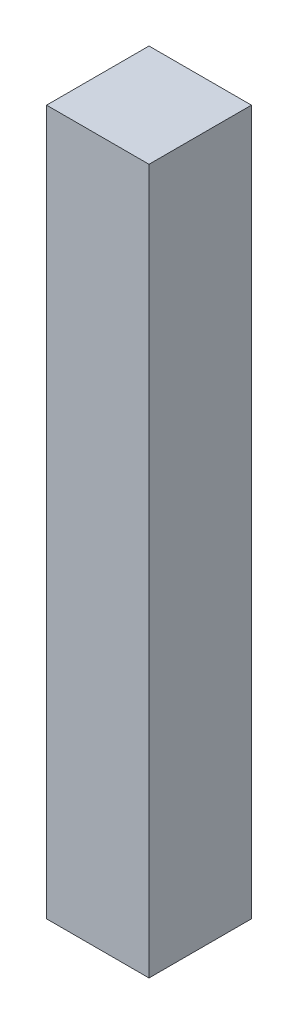
ISO-10303-21;
HEADER;
FILE_DESCRIPTION(('STEP AP214'),'2;1');
FILE_NAME('part.step','',(''),(''),'','','');
FILE_SCHEMA(('AUTOMOTIVE_DESIGN { 1 0 10303 214 1 1 1 1 }'));
ENDSEC;
DATA;
#1=APPLICATION_CONTEXT('core data for automotive mechanical design processes');
#2=APPLICATION_PROTOCOL_DEFINITION('international standard','automotive_design',2000,#1);
#3=PRODUCT_CONTEXT('',#1,'mechanical');
#4=PRODUCT('Part','Part','',(#3));
#5=PRODUCT_RELATED_PRODUCT_CATEGORY('part','',(#4));
#6=PRODUCT_DEFINITION_FORMATION('','',#4);
#7=PRODUCT_DEFINITION_CONTEXT('part definition',#1,'design');
#8=PRODUCT_DEFINITION('design','',#6,#7);
#9=PRODUCT_DEFINITION_SHAPE('','',#8);
#10=(LENGTH_UNIT() NAMED_UNIT(*) SI_UNIT(.MILLI.,.METRE.));
#11=(NAMED_UNIT(*) PLANE_ANGLE_UNIT() SI_UNIT($,.RADIAN.));
#12=(NAMED_UNIT(*) SI_UNIT($,.STERADIAN.) SOLID_ANGLE_UNIT());
#13=UNCERTAINTY_MEASURE_WITH_UNIT(LENGTH_MEASURE(1.E-05),#10,'distance_accuracy_value','');
#14=(GEOMETRIC_REPRESENTATION_CONTEXT(3) GLOBAL_UNCERTAINTY_ASSIGNED_CONTEXT((#13)) GLOBAL_UNIT_ASSIGNED_CONTEXT((#10,
#11,#12)) REPRESENTATION_CONTEXT('',''));
#15=CARTESIAN_POINT('',(0.,0.,0.));
#16=DIRECTION('',(0.,0.,1.));
#17=DIRECTION('',(1.,0.,0.));
#18=AXIS2_PLACEMENT_3D('',#15,#16,#17);
#19=CARTESIAN_POINT('',(7.493,103.1113,7.493));
#20=DIRECTION('',(-1.,0.,0.));
#21=DIRECTION('',(0.,0.,1.));
#22=AXIS2_PLACEMENT_3D('',#19,#20,#21);
#23=PLANE('',#22);
#24=DIRECTION('',(0.,0.,-1.));
#25=VECTOR('',#24,1.);
#26=CARTESIAN_POINT('',(7.493,0.,7.493));
#27=LINE('',#26,#25);
#28=CARTESIAN_POINT('',(7.493,0.,7.493));
#29=VERTEX_POINT('',#28);
#30=CARTESIAN_POINT('',(7.493,0.,-7.493));
#31=VERTEX_POINT('',#30);
#32=EDGE_CURVE('E96',#29,#31,#27,.T.);
#33=ORIENTED_EDGE('',*,*,#32,.T.);
#34=DIRECTION('',(0.,-1.,0.));
#35=VECTOR('',#34,1.);
#36=CARTESIAN_POINT('',(7.493,103.1113,-7.493));
#37=LINE('',#36,#35);
#38=CARTESIAN_POINT('',(7.493,103.1113,-7.493));
#39=VERTEX_POINT('',#38);
#40=EDGE_CURVE('E11',#39,#31,#37,.T.);
#41=ORIENTED_EDGE('',*,*,#40,.F.);
#42=DIRECTION('',(0.,0.,-1.));
#43=VECTOR('',#42,1.);
#44=CARTESIAN_POINT('',(7.493,103.1113,7.493));
#45=LINE('',#44,#43);
#46=CARTESIAN_POINT('',(7.493,103.1113,7.493));
#47=VERTEX_POINT('',#46);
#48=EDGE_CURVE('E84',#47,#39,#45,.T.);
#49=ORIENTED_EDGE('',*,*,#48,.F.);
#50=DIRECTION('',(0.,-1.,0.));
#51=VECTOR('',#50,1.);
#52=CARTESIAN_POINT('',(7.493,103.1113,7.493));
#53=LINE('',#52,#51);
#54=EDGE_CURVE('E92',#47,#29,#53,.T.);
#55=ORIENTED_EDGE('',*,*,#54,.T.);
#56=EDGE_LOOP('',(#33,#41,#49,#55));
#57=FACE_BOUND('',#56,.T.);
#58=ADVANCED_FACE('F33',(#57),#23,.F.);
#59=CARTESIAN_POINT('',(-7.493,103.1113,-7.493));
#60=DIRECTION('',(0.,0.,1.));
#61=DIRECTION('',(1.,0.,0.));
#62=AXIS2_PLACEMENT_3D('',#59,#60,#61);
#63=PLANE('',#62);
#64=DIRECTION('',(-1.,0.,0.));
#65=VECTOR('',#64,1.);
#66=CARTESIAN_POINT('',(-7.493,0.,-7.493));
#67=LINE('',#66,#65);
#68=CARTESIAN_POINT('',(-7.493,0.,-7.493));
#69=VERTEX_POINT('',#68);
#70=EDGE_CURVE('E88',#31,#69,#67,.T.);
#71=ORIENTED_EDGE('',*,*,#70,.T.);
#72=DIRECTION('',(0.,-1.,0.));
#73=VECTOR('',#72,1.);
#74=CARTESIAN_POINT('',(-7.493,103.1113,-7.493));
#75=LINE('',#74,#73);
#76=CARTESIAN_POINT('',(-7.493,103.1113,-7.493));
#77=VERTEX_POINT('',#76);
#78=EDGE_CURVE('E41',#77,#69,#75,.T.);
#79=ORIENTED_EDGE('',*,*,#78,.F.);
#80=DIRECTION('',(-1.,0.,0.));
#81=VECTOR('',#80,1.);
#82=CARTESIAN_POINT('',(-7.493,103.1113,-7.493));
#83=LINE('',#82,#81);
#84=EDGE_CURVE('E79',#39,#77,#83,.T.);
#85=ORIENTED_EDGE('',*,*,#84,.F.);
#86=ORIENTED_EDGE('',*,*,#40,.T.);
#87=EDGE_LOOP('',(#71,#79,#85,#86));
#88=FACE_BOUND('',#87,.T.);
#89=ADVANCED_FACE('F87',(#88),#63,.F.);
#90=CARTESIAN_POINT('',(-7.493,103.1113,7.493));
#91=DIRECTION('',(1.,0.,0.));
#92=DIRECTION('',(0.,0.,-1.));
#93=AXIS2_PLACEMENT_3D('',#90,#91,#92);
#94=PLANE('',#93);
#95=DIRECTION('',(0.,0.,1.));
#96=VECTOR('',#95,1.);
#97=CARTESIAN_POINT('',(-7.493,0.,7.493));
#98=LINE('',#97,#96);
#99=CARTESIAN_POINT('',(-7.493,0.,7.493));
#100=VERTEX_POINT('',#99);
#101=EDGE_CURVE('E66',#69,#100,#98,.T.);
#102=ORIENTED_EDGE('',*,*,#101,.T.);
#103=DIRECTION('',(0.,-1.,0.));
#104=VECTOR('',#103,1.);
#105=CARTESIAN_POINT('',(-7.493,103.1113,7.493));
#106=LINE('',#105,#104);
#107=CARTESIAN_POINT('',(-7.493,103.1113,7.493));
#108=VERTEX_POINT('',#107);
#109=EDGE_CURVE('E89',#108,#100,#106,.T.);
#110=ORIENTED_EDGE('',*,*,#109,.F.);
#111=DIRECTION('',(0.,0.,1.));
#112=VECTOR('',#111,1.);
#113=CARTESIAN_POINT('',(-7.493,103.1113,7.493));
#114=LINE('',#113,#112);
#115=EDGE_CURVE('E82',#77,#108,#114,.T.);
#116=ORIENTED_EDGE('',*,*,#115,.F.);
#117=ORIENTED_EDGE('',*,*,#78,.T.);
#118=EDGE_LOOP('',(#102,#110,#116,#117));
#119=FACE_BOUND('',#118,.T.);
#120=ADVANCED_FACE('F90',(#119),#94,.F.);
#121=CARTESIAN_POINT('',(-7.493,103.1113,7.493));
#122=DIRECTION('',(0.,0.,-1.));
#123=DIRECTION('',(-1.,0.,0.));
#124=AXIS2_PLACEMENT_3D('',#121,#122,#123);
#125=PLANE('',#124);
#126=DIRECTION('',(1.,0.,0.));
#127=VECTOR('',#126,1.);
#128=CARTESIAN_POINT('',(-7.493,0.,7.493));
#129=LINE('',#128,#127);
#130=EDGE_CURVE('E72',#100,#29,#129,.T.);
#131=ORIENTED_EDGE('',*,*,#130,.T.);
#132=ORIENTED_EDGE('',*,*,#54,.F.);
#133=DIRECTION('',(1.,0.,0.));
#134=VECTOR('',#133,1.);
#135=CARTESIAN_POINT('',(-7.493,103.1113,7.493));
#136=LINE('',#135,#134);
#137=EDGE_CURVE('E49',#108,#47,#136,.T.);
#138=ORIENTED_EDGE('',*,*,#137,.F.);
#139=ORIENTED_EDGE('',*,*,#109,.T.);
#140=EDGE_LOOP('',(#131,#132,#138,#139));
#141=FACE_BOUND('',#140,.T.);
#142=ADVANCED_FACE('F103',(#141),#125,.F.);
#143=CARTESIAN_POINT('',(0.,103.1113,0.));
#144=DIRECTION('',(0.,-1.,0.));
#145=DIRECTION('',(0.,0.,-1.));
#146=AXIS2_PLACEMENT_3D('',#143,#144,#145);
#147=PLANE('',#146);
#148=ORIENTED_EDGE('',*,*,#48,.T.);
#149=ORIENTED_EDGE('',*,*,#84,.T.);
#150=ORIENTED_EDGE('',*,*,#115,.T.);
#151=ORIENTED_EDGE('',*,*,#137,.T.);
#152=EDGE_LOOP('',(#148,#149,#150,#151));
#153=FACE_BOUND('',#152,.T.);
#154=ADVANCED_FACE('F80',(#153),#147,.F.);
#155=CARTESIAN_POINT('',(0.,0.,0.));
#156=DIRECTION('',(0.,-1.,0.));
#157=DIRECTION('',(0.,0.,-1.));
#158=AXIS2_PLACEMENT_3D('',#155,#156,#157);
#159=PLANE('',#158);
#160=ORIENTED_EDGE('',*,*,#32,.F.);
#161=ORIENTED_EDGE('',*,*,#130,.F.);
#162=ORIENTED_EDGE('',*,*,#101,.F.);
#163=ORIENTED_EDGE('',*,*,#70,.F.);
#164=EDGE_LOOP('',(#160,#161,#162,#163));
#165=FACE_BOUND('',#164,.T.);
#166=ADVANCED_FACE('F106',(#165),#159,.T.);
#167=CLOSED_SHELL('',(#58,#89,#120,#142,#154,#166));
#168=MANIFOLD_SOLID_BREP('B2',#167);
#169=ADVANCED_BREP_SHAPE_REPRESENTATION('',(#18,#168),#14);
#170=SHAPE_DEFINITION_REPRESENTATION(#9,#169);
ENDSEC;
END-ISO-10303-21;
